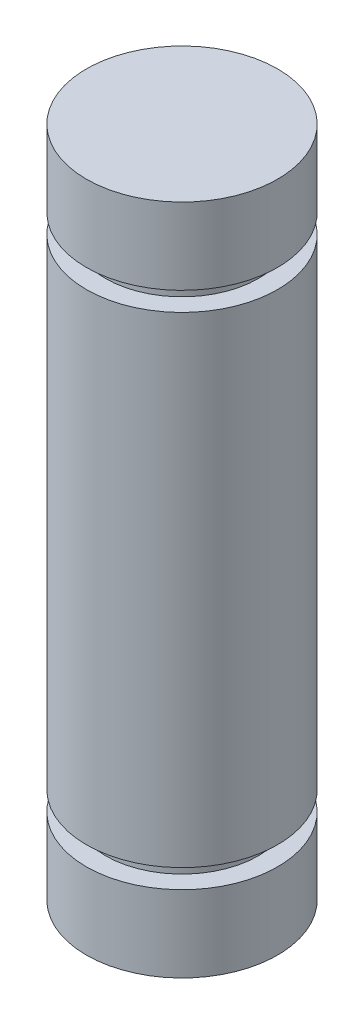
ISO-10303-21;
HEADER;
FILE_DESCRIPTION(('STEP AP214'),'2;1');
FILE_NAME('part.step','',(''),(''),'','','');
FILE_SCHEMA(('AUTOMOTIVE_DESIGN { 1 0 10303 214 1 1 1 1 }'));
ENDSEC;
DATA;
#1=APPLICATION_CONTEXT('core data for automotive mechanical design processes');
#2=APPLICATION_PROTOCOL_DEFINITION('international standard','automotive_design',2000,#1);
#3=PRODUCT_CONTEXT('',#1,'mechanical');
#4=PRODUCT('Part','Part','',(#3));
#5=PRODUCT_RELATED_PRODUCT_CATEGORY('part','',(#4));
#6=PRODUCT_DEFINITION_FORMATION('','',#4);
#7=PRODUCT_DEFINITION_CONTEXT('part definition',#1,'design');
#8=PRODUCT_DEFINITION('design','',#6,#7);
#9=PRODUCT_DEFINITION_SHAPE('','',#8);
#10=(LENGTH_UNIT() NAMED_UNIT(*) SI_UNIT(.MILLI.,.METRE.));
#11=(NAMED_UNIT(*) PLANE_ANGLE_UNIT() SI_UNIT($,.RADIAN.));
#12=(NAMED_UNIT(*) SI_UNIT($,.STERADIAN.) SOLID_ANGLE_UNIT());
#13=UNCERTAINTY_MEASURE_WITH_UNIT(LENGTH_MEASURE(1.E-05),#10,'distance_accuracy_value','');
#14=(GEOMETRIC_REPRESENTATION_CONTEXT(3) GLOBAL_UNCERTAINTY_ASSIGNED_CONTEXT((#13)) GLOBAL_UNIT_ASSIGNED_CONTEXT((#10,
#11,#12)) REPRESENTATION_CONTEXT('',''));
#15=CARTESIAN_POINT('',(0.,0.,0.));
#16=DIRECTION('',(0.,0.,1.));
#17=DIRECTION('',(1.,0.,0.));
#18=AXIS2_PLACEMENT_3D('',#15,#16,#17);
#19=CARTESIAN_POINT('',(0.,0.,0.));
#20=DIRECTION('',(0.,1.,0.));
#21=DIRECTION('',(0.,0.,1.));
#22=AXIS2_PLACEMENT_3D('',#19,#20,#21);
#23=PLANE('',#22);
#24=CARTESIAN_POINT('',(0.,0.,0.));
#25=DIRECTION('',(0.,1.,0.));
#26=DIRECTION('',(0.,0.,1.));
#27=AXIS2_PLACEMENT_3D('',#24,#25,#26);
#28=CIRCLE('',#27,6.35);
#29=CARTESIAN_POINT('',(0.,0.,6.35));
#30=VERTEX_POINT('',#29);
#31=EDGE_CURVE('E42',#30,#30,#28,.T.);
#32=ORIENTED_EDGE('',*,*,#31,.F.);
#33=EDGE_LOOP('',(#32));
#34=FACE_BOUND('',#33,.T.);
#35=CARTESIAN_POINT('',(0.,0.,0.));
#36=DIRECTION('',(0.,1.,0.));
#37=DIRECTION('',(0.,0.,1.));
#38=AXIS2_PLACEMENT_3D('',#35,#36,#37);
#39=CIRCLE('',#38,5.08);
#40=CARTESIAN_POINT('',(0.,0.,5.08));
#41=VERTEX_POINT('',#40);
#42=EDGE_CURVE('E10',#41,#41,#39,.F.);
#43=ORIENTED_EDGE('',*,*,#42,.F.);
#44=EDGE_LOOP('',(#43));
#45=FACE_BOUND('',#44,.T.);
#46=ADVANCED_FACE('F31',(#34,#45),#23,.F.);
#47=CARTESIAN_POINT('',(0.,31.9405,0.));
#48=DIRECTION('',(0.,1.,0.));
#49=DIRECTION('',(0.,0.,1.));
#50=AXIS2_PLACEMENT_3D('',#47,#48,#49);
#51=PLANE('',#50);
#52=CARTESIAN_POINT('',(0.,31.9405,0.));
#53=DIRECTION('',(0.,1.,0.));
#54=DIRECTION('',(0.,0.,1.));
#55=AXIS2_PLACEMENT_3D('',#52,#53,#54);
#56=CIRCLE('',#55,6.35);
#57=CARTESIAN_POINT('',(0.,31.9405,6.35));
#58=VERTEX_POINT('',#57);
#59=EDGE_CURVE('E38',#58,#58,#56,.T.);
#60=ORIENTED_EDGE('',*,*,#59,.T.);
#61=EDGE_LOOP('',(#60));
#62=FACE_BOUND('',#61,.T.);
#63=CARTESIAN_POINT('',(0.,31.9405,0.));
#64=DIRECTION('',(0.,1.,0.));
#65=DIRECTION('',(0.,0.,1.));
#66=AXIS2_PLACEMENT_3D('',#63,#64,#65);
#67=CIRCLE('',#66,5.08);
#68=CARTESIAN_POINT('',(0.,31.9405,5.08));
#69=VERTEX_POINT('',#68);
#70=EDGE_CURVE('E49',#69,#69,#67,.T.);
#71=ORIENTED_EDGE('',*,*,#70,.F.);
#72=EDGE_LOOP('',(#71));
#73=FACE_BOUND('',#72,.T.);
#74=ADVANCED_FACE('F95',(#62,#73),#51,.T.);
#75=CARTESIAN_POINT('',(0.,31.9405,0.));
#76=DIRECTION('',(0.,-1.,0.));
#77=DIRECTION('',(0.,0.,-1.));
#78=AXIS2_PLACEMENT_3D('',#75,#76,#77);
#79=CYLINDRICAL_SURFACE('',#78,6.35);
#80=ORIENTED_EDGE('',*,*,#59,.F.);
#81=EDGE_LOOP('',(#80));
#82=FACE_BOUND('',#81,.T.);
#83=ORIENTED_EDGE('',*,*,#31,.T.);
#84=EDGE_LOOP('',(#83));
#85=FACE_BOUND('',#84,.T.);
#86=ADVANCED_FACE('F33',(#82,#85),#79,.T.);
#87=CARTESIAN_POINT('',(0.,33.2105,0.));
#88=DIRECTION('',(0.,-1.,0.));
#89=DIRECTION('',(0.,0.,-1.));
#90=AXIS2_PLACEMENT_3D('',#87,#88,#89);
#91=CYLINDRICAL_SURFACE('',#90,5.08);
#92=CARTESIAN_POINT('',(0.,33.2105,0.));
#93=DIRECTION('',(0.,1.,0.));
#94=DIRECTION('',(0.,0.,1.));
#95=AXIS2_PLACEMENT_3D('',#92,#93,#94);
#96=CIRCLE('',#95,5.08);
#97=CARTESIAN_POINT('',(0.,33.2105,5.08));
#98=VERTEX_POINT('',#97);
#99=EDGE_CURVE('E47',#98,#98,#96,.T.);
#100=ORIENTED_EDGE('',*,*,#99,.F.);
#101=EDGE_LOOP('',(#100));
#102=FACE_BOUND('',#101,.T.);
#103=ORIENTED_EDGE('',*,*,#70,.T.);
#104=EDGE_LOOP('',(#103));
#105=FACE_BOUND('',#104,.T.);
#106=ADVANCED_FACE('F104',(#102,#105),#91,.T.);
#107=CARTESIAN_POINT('',(0.,33.2105,0.));
#108=DIRECTION('',(0.,1.,0.));
#109=DIRECTION('',(0.,0.,1.));
#110=AXIS2_PLACEMENT_3D('',#107,#108,#109);
#111=PLANE('',#110);
#112=CARTESIAN_POINT('',(0.,33.2105,0.));
#113=DIRECTION('',(0.,1.,0.));
#114=DIRECTION('',(0.,0.,1.));
#115=AXIS2_PLACEMENT_3D('',#112,#113,#114);
#116=CIRCLE('',#115,6.35);
#117=CARTESIAN_POINT('',(0.,33.2105,6.35));
#118=VERTEX_POINT('',#117);
#119=EDGE_CURVE('E55',#118,#118,#116,.T.);
#120=ORIENTED_EDGE('',*,*,#119,.F.);
#121=EDGE_LOOP('',(#120));
#122=FACE_BOUND('',#121,.T.);
#123=ORIENTED_EDGE('',*,*,#99,.T.);
#124=EDGE_LOOP('',(#123));
#125=FACE_BOUND('',#124,.T.);
#126=ADVANCED_FACE('F107',(#122,#125),#111,.F.);
#127=CARTESIAN_POINT('',(0.,38.2905,0.));
#128=DIRECTION('',(0.,-1.,0.));
#129=DIRECTION('',(0.,0.,-1.));
#130=AXIS2_PLACEMENT_3D('',#127,#128,#129);
#131=CYLINDRICAL_SURFACE('',#130,6.35);
#132=CARTESIAN_POINT('',(0.,38.2905,0.));
#133=DIRECTION('',(0.,1.,0.));
#134=DIRECTION('',(0.,0.,1.));
#135=AXIS2_PLACEMENT_3D('',#132,#133,#134);
#136=CIRCLE('',#135,6.35);
#137=CARTESIAN_POINT('',(0.,38.2905,6.35));
#138=VERTEX_POINT('',#137);
#139=EDGE_CURVE('E52',#138,#138,#136,.T.);
#140=ORIENTED_EDGE('',*,*,#139,.F.);
#141=EDGE_LOOP('',(#140));
#142=FACE_BOUND('',#141,.T.);
#143=ORIENTED_EDGE('',*,*,#119,.T.);
#144=EDGE_LOOP('',(#143));
#145=FACE_BOUND('',#144,.T.);
#146=ADVANCED_FACE('F91',(#142,#145),#131,.T.);
#147=CARTESIAN_POINT('',(0.,38.2905,0.));
#148=DIRECTION('',(0.,1.,0.));
#149=DIRECTION('',(0.,0.,1.));
#150=AXIS2_PLACEMENT_3D('',#147,#148,#149);
#151=PLANE('',#150);
#152=ORIENTED_EDGE('',*,*,#139,.T.);
#153=EDGE_LOOP('',(#152));
#154=FACE_BOUND('',#153,.T.);
#155=ADVANCED_FACE('F86',(#154),#151,.T.);
#156=CARTESIAN_POINT('',(0.,-1.27,0.));
#157=DIRECTION('',(0.,1.,0.));
#158=DIRECTION('',(0.,0.,1.));
#159=AXIS2_PLACEMENT_3D('',#156,#157,#158);
#160=CYLINDRICAL_SURFACE('',#159,5.08);
#161=CARTESIAN_POINT('',(0.,-1.27,0.));
#162=DIRECTION('',(0.,-1.,0.));
#163=DIRECTION('',(0.,0.,-1.));
#164=AXIS2_PLACEMENT_3D('',#161,#162,#163);
#165=CIRCLE('',#164,5.08);
#166=CARTESIAN_POINT('',(0.,-1.27,-5.08));
#167=VERTEX_POINT('',#166);
#168=EDGE_CURVE('E58',#167,#167,#165,.T.);
#169=ORIENTED_EDGE('',*,*,#168,.F.);
#170=EDGE_LOOP('',(#169));
#171=FACE_BOUND('',#170,.T.);
#172=ORIENTED_EDGE('',*,*,#42,.T.);
#173=EDGE_LOOP('',(#172));
#174=FACE_BOUND('',#173,.T.);
#175=ADVANCED_FACE('F81',(#171,#174),#160,.T.);
#176=CARTESIAN_POINT('',(0.,-1.27,0.));
#177=DIRECTION('',(0.,-1.,0.));
#178=DIRECTION('',(0.,0.,-1.));
#179=AXIS2_PLACEMENT_3D('',#176,#177,#178);
#180=PLANE('',#179);
#181=CARTESIAN_POINT('',(0.,-1.27,0.));
#182=DIRECTION('',(0.,-1.,0.));
#183=DIRECTION('',(0.,0.,-1.));
#184=AXIS2_PLACEMENT_3D('',#181,#182,#183);
#185=CIRCLE('',#184,6.35);
#186=CARTESIAN_POINT('',(0.,-1.27,-6.35));
#187=VERTEX_POINT('',#186);
#188=EDGE_CURVE('E64',#187,#187,#185,.T.);
#189=ORIENTED_EDGE('',*,*,#188,.F.);
#190=EDGE_LOOP('',(#189));
#191=FACE_BOUND('',#190,.T.);
#192=ORIENTED_EDGE('',*,*,#168,.T.);
#193=EDGE_LOOP('',(#192));
#194=FACE_BOUND('',#193,.T.);
#195=ADVANCED_FACE('F75',(#191,#194),#180,.F.);
#196=CARTESIAN_POINT('',(0.,-6.35,0.));
#197=DIRECTION('',(0.,1.,0.));
#198=DIRECTION('',(0.,0.,1.));
#199=AXIS2_PLACEMENT_3D('',#196,#197,#198);
#200=CYLINDRICAL_SURFACE('',#199,6.35);
#201=CARTESIAN_POINT('',(0.,-6.35,0.));
#202=DIRECTION('',(0.,-1.,0.));
#203=DIRECTION('',(0.,0.,-1.));
#204=AXIS2_PLACEMENT_3D('',#201,#202,#203);
#205=CIRCLE('',#204,6.35);
#206=CARTESIAN_POINT('',(0.,-6.35,-6.35));
#207=VERTEX_POINT('',#206);
#208=EDGE_CURVE('E63',#207,#207,#205,.T.);
#209=ORIENTED_EDGE('',*,*,#208,.F.);
#210=EDGE_LOOP('',(#209));
#211=FACE_BOUND('',#210,.T.);
#212=ORIENTED_EDGE('',*,*,#188,.T.);
#213=EDGE_LOOP('',(#212));
#214=FACE_BOUND('',#213,.T.);
#215=ADVANCED_FACE('F72',(#211,#214),#200,.T.);
#216=CARTESIAN_POINT('',(0.,-6.35,0.));
#217=DIRECTION('',(0.,-1.,0.));
#218=DIRECTION('',(0.,0.,-1.));
#219=AXIS2_PLACEMENT_3D('',#216,#217,#218);
#220=PLANE('',#219);
#221=ORIENTED_EDGE('',*,*,#208,.T.);
#222=EDGE_LOOP('',(#221));
#223=FACE_BOUND('',#222,.T.);
#224=ADVANCED_FACE('F70',(#223),#220,.T.);
#225=CLOSED_SHELL('',(#46,#74,#86,#106,#126,#146,#155,#175,#195,#215,#224));
#226=MANIFOLD_SOLID_BREP('B2',#225);
#227=ADVANCED_BREP_SHAPE_REPRESENTATION('',(#18,#226),#14);
#228=SHAPE_DEFINITION_REPRESENTATION(#9,#227);
ENDSEC;
END-ISO-10303-21;
